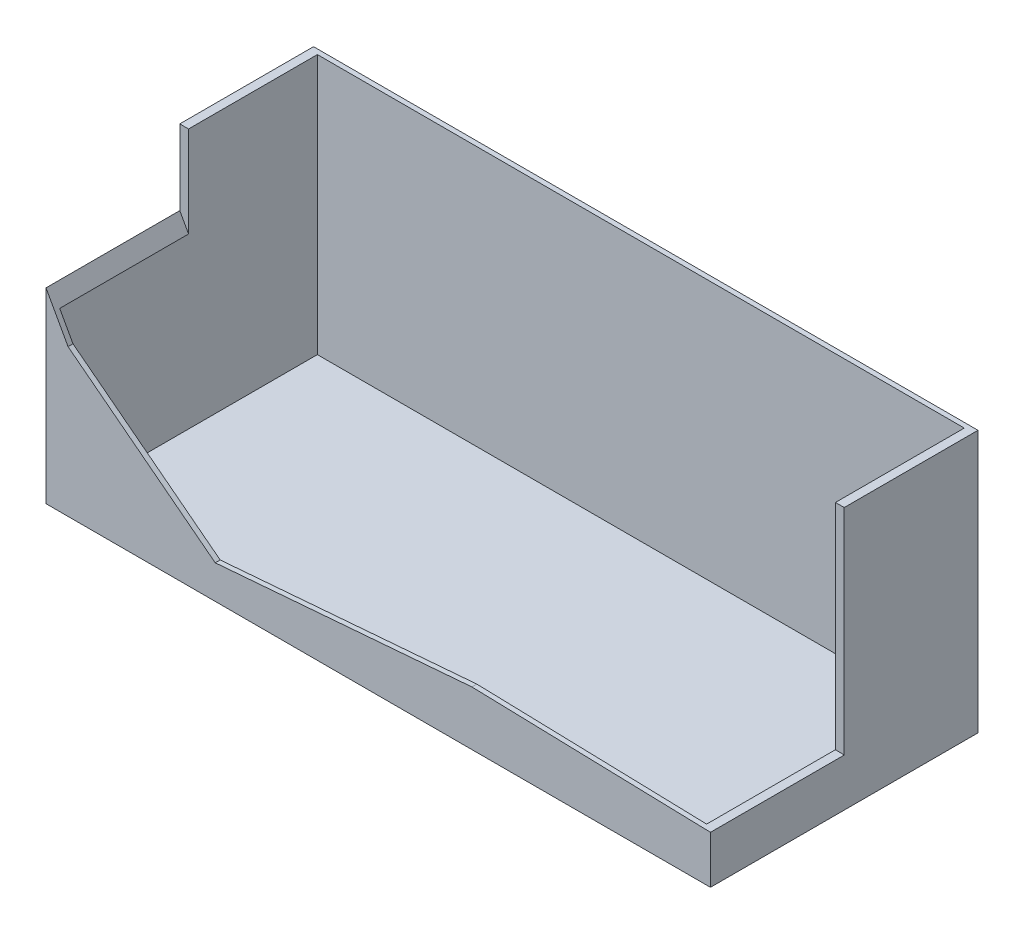
ISO-10303-21;
HEADER;
FILE_DESCRIPTION(('STEP AP214'),'2;1');
FILE_NAME('part.step','',(''),(''),'','','');
FILE_SCHEMA(('AUTOMOTIVE_DESIGN { 1 0 10303 214 1 1 1 1 }'));
ENDSEC;
DATA;
#1=APPLICATION_CONTEXT('core data for automotive mechanical design processes');
#2=APPLICATION_PROTOCOL_DEFINITION('international standard','automotive_design',2000,#1);
#3=PRODUCT_CONTEXT('',#1,'mechanical');
#4=PRODUCT('Part','Part','',(#3));
#5=PRODUCT_RELATED_PRODUCT_CATEGORY('part','',(#4));
#6=PRODUCT_DEFINITION_FORMATION('','',#4);
#7=PRODUCT_DEFINITION_CONTEXT('part definition',#1,'design');
#8=PRODUCT_DEFINITION('design','',#6,#7);
#9=PRODUCT_DEFINITION_SHAPE('','',#8);
#10=(LENGTH_UNIT() NAMED_UNIT(*) SI_UNIT(.MILLI.,.METRE.));
#11=(NAMED_UNIT(*) PLANE_ANGLE_UNIT() SI_UNIT($,.RADIAN.));
#12=(NAMED_UNIT(*) SI_UNIT($,.STERADIAN.) SOLID_ANGLE_UNIT());
#13=UNCERTAINTY_MEASURE_WITH_UNIT(LENGTH_MEASURE(1.E-05),#10,'distance_accuracy_value','');
#14=(GEOMETRIC_REPRESENTATION_CONTEXT(3) GLOBAL_UNCERTAINTY_ASSIGNED_CONTEXT((#13)) GLOBAL_UNIT_ASSIGNED_CONTEXT((#10,
#11,#12)) REPRESENTATION_CONTEXT('',''));
#15=CARTESIAN_POINT('',(0.,0.,0.));
#16=DIRECTION('',(0.,0.,1.));
#17=DIRECTION('',(1.,0.,0.));
#18=AXIS2_PLACEMENT_3D('',#15,#16,#17);
#19=CARTESIAN_POINT('',(0.,2390.,0.));
#20=DIRECTION('',(0.,-1.,0.));
#21=DIRECTION('',(0.,0.,-1.));
#22=AXIS2_PLACEMENT_3D('',#19,#20,#21);
#23=PLANE('',#22);
#24=DIRECTION('',(-1.,0.,0.));
#25=VECTOR('',#24,1.);
#26=CARTESIAN_POINT('',(0.,2390.,0.));
#27=LINE('',#26,#25);
#28=CARTESIAN_POINT('',(3030.,2390.,0.));
#29=VERTEX_POINT('',#28);
#30=CARTESIAN_POINT('',(2950.,2390.,0.));
#31=VERTEX_POINT('',#30);
#32=EDGE_CURVE('E187',#29,#31,#27,.T.);
#33=ORIENTED_EDGE('',*,*,#32,.F.);
#34=DIRECTION('',(0.,0.,-1.));
#35=VECTOR('',#34,1.);
#36=CARTESIAN_POINT('',(3030.,2390.,1220.));
#37=LINE('',#36,#35);
#38=CARTESIAN_POINT('',(3030.,2390.,-1220.));
#39=VERTEX_POINT('',#38);
#40=EDGE_CURVE('E216',#29,#39,#37,.T.);
#41=ORIENTED_EDGE('',*,*,#40,.T.);
#42=DIRECTION('',(-1.,0.,0.));
#43=VECTOR('',#42,1.);
#44=CARTESIAN_POINT('',(-3030.,2390.,-1220.));
#45=LINE('',#44,#43);
#46=CARTESIAN_POINT('',(-3030.,2390.,-1220.));
#47=VERTEX_POINT('',#46);
#48=EDGE_CURVE('E218',#39,#47,#45,.T.);
#49=ORIENTED_EDGE('',*,*,#48,.T.);
#50=DIRECTION('',(0.,0.,1.));
#51=VECTOR('',#50,1.);
#52=CARTESIAN_POINT('',(-3030.,2390.,1220.));
#53=LINE('',#52,#51);
#54=CARTESIAN_POINT('',(-3030.,2390.,0.));
#55=VERTEX_POINT('',#54);
#56=EDGE_CURVE('E221',#47,#55,#53,.T.);
#57=ORIENTED_EDGE('',*,*,#56,.T.);
#58=CARTESIAN_POINT('',(-2950.,2390.,0.));
#59=VERTEX_POINT('',#58);
#60=EDGE_CURVE('E190',#59,#55,#27,.T.);
#61=ORIENTED_EDGE('',*,*,#60,.F.);
#62=DIRECTION('',(0.,0.,1.));
#63=VECTOR('',#62,1.);
#64=CARTESIAN_POINT('',(-2950.,2390.,-1175.));
#65=LINE('',#64,#63);
#66=CARTESIAN_POINT('',(-2950.,2390.,-1175.));
#67=VERTEX_POINT('',#66);
#68=EDGE_CURVE('E206',#67,#59,#65,.T.);
#69=ORIENTED_EDGE('',*,*,#68,.F.);
#70=DIRECTION('',(-1.,0.,0.));
#71=VECTOR('',#70,1.);
#72=CARTESIAN_POINT('',(2950.,2390.,-1175.));
#73=LINE('',#72,#71);
#74=CARTESIAN_POINT('',(2950.,2390.,-1175.));
#75=VERTEX_POINT('',#74);
#76=EDGE_CURVE('E147',#75,#67,#73,.T.);
#77=ORIENTED_EDGE('',*,*,#76,.F.);
#78=DIRECTION('',(0.,0.,-1.));
#79=VECTOR('',#78,1.);
#80=CARTESIAN_POINT('',(2950.,2390.,-1175.));
#81=LINE('',#80,#79);
#82=EDGE_CURVE('E208',#31,#75,#81,.T.);
#83=ORIENTED_EDGE('',*,*,#82,.F.);
#84=EDGE_LOOP('',(#33,#41,#49,#57,#61,#69,#77,#83));
#85=FACE_BOUND('',#84,.T.);
#86=ADVANCED_FACE('F33',(#85),#23,.F.);
#87=CARTESIAN_POINT('',(3030.,2390.,1220.));
#88=DIRECTION('',(-1.,0.,0.));
#89=DIRECTION('',(0.,0.,1.));
#90=AXIS2_PLACEMENT_3D('',#87,#88,#89);
#91=PLANE('',#90);
#92=DIRECTION('',(0.,-1.,0.));
#93=VECTOR('',#92,1.);
#94=CARTESIAN_POINT('',(3030.,2390.,1220.));
#95=LINE('',#94,#93);
#96=CARTESIAN_POINT('',(3030.,434.828509298348,1220.));
#97=VERTEX_POINT('',#96);
#98=CARTESIAN_POINT('',(3030.,0.,1220.));
#99=VERTEX_POINT('',#98);
#100=EDGE_CURVE('E224',#97,#99,#95,.T.);
#101=ORIENTED_EDGE('',*,*,#100,.T.);
#102=DIRECTION('',(0.,0.,-1.));
#103=VECTOR('',#102,1.);
#104=CARTESIAN_POINT('',(3030.,0.,1220.));
#105=LINE('',#104,#103);
#106=CARTESIAN_POINT('',(3030.,0.,-1220.));
#107=VERTEX_POINT('',#106);
#108=EDGE_CURVE('E215',#99,#107,#105,.T.);
#109=ORIENTED_EDGE('',*,*,#108,.T.);
#110=DIRECTION('',(0.,-1.,0.));
#111=VECTOR('',#110,1.);
#112=CARTESIAN_POINT('',(3030.,2390.,-1220.));
#113=LINE('',#112,#111);
#114=EDGE_CURVE('E240',#39,#107,#113,.T.);
#115=ORIENTED_EDGE('',*,*,#114,.F.);
#116=ORIENTED_EDGE('',*,*,#40,.F.);
#117=DIRECTION('',(0.,1.,0.));
#118=VECTOR('',#117,1.);
#119=CARTESIAN_POINT('',(3030.,2390.,0.));
#120=LINE('',#119,#118);
#121=CARTESIAN_POINT('',(3030.,434.828509298348,0.));
#122=VERTEX_POINT('',#121);
#123=EDGE_CURVE('E189',#122,#29,#120,.T.);
#124=ORIENTED_EDGE('',*,*,#123,.F.);
#125=DIRECTION('',(0.,0.,-1.));
#126=VECTOR('',#125,1.);
#127=CARTESIAN_POINT('',(3030.,434.828509298348,1220.));
#128=LINE('',#127,#126);
#129=EDGE_CURVE('E200',#97,#122,#128,.T.);
#130=ORIENTED_EDGE('',*,*,#129,.F.);
#131=EDGE_LOOP('',(#101,#109,#115,#116,#124,#130));
#132=FACE_BOUND('',#131,.T.);
#133=ADVANCED_FACE('F35',(#132),#91,.F.);
#134=CARTESIAN_POINT('',(-3030.,2390.,1220.));
#135=DIRECTION('',(1.,0.,0.));
#136=DIRECTION('',(0.,0.,-1.));
#137=AXIS2_PLACEMENT_3D('',#134,#135,#136);
#138=PLANE('',#137);
#139=DIRECTION('',(0.,-1.,0.));
#140=VECTOR('',#139,1.);
#141=CARTESIAN_POINT('',(-3030.,2390.,-1220.));
#142=LINE('',#141,#140);
#143=CARTESIAN_POINT('',(-3030.,0.,-1220.));
#144=VERTEX_POINT('',#143);
#145=EDGE_CURVE('E238',#47,#144,#142,.T.);
#146=ORIENTED_EDGE('',*,*,#145,.T.);
#147=DIRECTION('',(0.,0.,1.));
#148=VECTOR('',#147,1.);
#149=CARTESIAN_POINT('',(-3030.,0.,1220.));
#150=LINE('',#149,#148);
#151=CARTESIAN_POINT('',(-3030.,0.,1220.));
#152=VERTEX_POINT('',#151);
#153=EDGE_CURVE('E230',#144,#152,#150,.T.);
#154=ORIENTED_EDGE('',*,*,#153,.T.);
#155=DIRECTION('',(0.,-1.,0.));
#156=VECTOR('',#155,1.);
#157=CARTESIAN_POINT('',(-3030.,2390.,1220.));
#158=LINE('',#157,#156);
#159=CARTESIAN_POINT('',(-3030.,1705.07723488189,1220.));
#160=VERTEX_POINT('',#159);
#161=EDGE_CURVE('E236',#160,#152,#158,.T.);
#162=ORIENTED_EDGE('',*,*,#161,.F.);
#163=DIRECTION('',(0.,0.,1.));
#164=VECTOR('',#163,1.);
#165=CARTESIAN_POINT('',(-3030.,1705.07723488189,1220.));
#166=LINE('',#165,#164);
#167=CARTESIAN_POINT('',(-3030.,1705.07723488189,0.));
#168=VERTEX_POINT('',#167);
#169=EDGE_CURVE('E204',#168,#160,#166,.T.);
#170=ORIENTED_EDGE('',*,*,#169,.F.);
#171=DIRECTION('',(0.,-1.,0.));
#172=VECTOR('',#171,1.);
#173=CARTESIAN_POINT('',(-3030.,2390.,0.));
#174=LINE('',#173,#172);
#175=EDGE_CURVE('E195',#55,#168,#174,.T.);
#176=ORIENTED_EDGE('',*,*,#175,.F.);
#177=ORIENTED_EDGE('',*,*,#56,.F.);
#178=EDGE_LOOP('',(#146,#154,#162,#170,#176,#177));
#179=FACE_BOUND('',#178,.T.);
#180=ADVANCED_FACE('F269',(#179),#138,.F.);
#181=CARTESIAN_POINT('',(-3030.,2390.,1220.));
#182=DIRECTION('',(0.,0.,-1.));
#183=DIRECTION('',(-1.,0.,0.));
#184=AXIS2_PLACEMENT_3D('',#181,#182,#183);
#185=PLANE('',#184);
#186=ORIENTED_EDGE('',*,*,#161,.T.);
#187=DIRECTION('',(1.,0.,0.));
#188=VECTOR('',#187,1.);
#189=CARTESIAN_POINT('',(-3030.,0.,1220.));
#190=LINE('',#189,#188);
#191=EDGE_CURVE('E219',#152,#99,#190,.T.);
#192=ORIENTED_EDGE('',*,*,#191,.T.);
#193=ORIENTED_EDGE('',*,*,#100,.F.);
#194=DIRECTION('',(0.999617636638247,-0.0276510491982812,0.));
#195=VECTOR('',#194,1.);
#196=CARTESIAN_POINT('',(854.001038062535,495.020178739367,1220.));
#197=LINE('',#196,#195);
#198=CARTESIAN_POINT('',(854.001038062535,495.020178739367,1220.));
#199=VERTEX_POINT('',#198);
#200=EDGE_CURVE('E172',#199,#97,#197,.T.);
#201=ORIENTED_EDGE('',*,*,#200,.F.);
#202=DIRECTION('',(0.996720748067837,0.0809181708338226,0.));
#203=VECTOR('',#202,1.);
#204=CARTESIAN_POINT('',(-1486.38471924519,305.017377158293,1220.));
#205=LINE('',#204,#203);
#206=CARTESIAN_POINT('',(-1486.38471924519,305.017377158293,1220.));
#207=VERTEX_POINT('',#206);
#208=EDGE_CURVE('E170',#207,#199,#205,.T.);
#209=ORIENTED_EDGE('',*,*,#208,.F.);
#210=DIRECTION('',(0.79165389315685,-0.610969813861211,0.));
#211=VECTOR('',#210,1.);
#212=CARTESIAN_POINT('',(-2829.06610650991,1341.25026168414,1220.));
#213=LINE('',#212,#211);
#214=CARTESIAN_POINT('',(-2829.06610650991,1341.25026168414,1220.));
#215=VERTEX_POINT('',#214);
#216=EDGE_CURVE('E167',#215,#207,#213,.T.);
#217=ORIENTED_EDGE('',*,*,#216,.F.);
#218=DIRECTION('',(0.483449472044467,-0.875372268226454,0.));
#219=VECTOR('',#218,1.);
#220=CARTESIAN_POINT('',(-3446.15752728708,2458.60532761151,1220.));
#221=LINE('',#220,#219);
#222=EDGE_CURVE('E165',#160,#215,#221,.T.);
#223=ORIENTED_EDGE('',*,*,#222,.F.);
#224=EDGE_LOOP('',(#186,#192,#193,#201,#209,#217,#223));
#225=FACE_BOUND('',#224,.T.);
#226=ADVANCED_FACE('F275',(#225),#185,.F.);
#227=CARTESIAN_POINT('',(-2950.,2390.,-1175.));
#228=DIRECTION('',(1.,0.,0.));
#229=DIRECTION('',(0.,0.,-1.));
#230=AXIS2_PLACEMENT_3D('',#227,#228,#229);
#231=PLANE('',#230);
#232=DIRECTION('',(0.,0.,1.));
#233=VECTOR('',#232,1.);
#234=CARTESIAN_POINT('',(-2950.,20.,-1175.));
#235=LINE('',#234,#233);
#236=CARTESIAN_POINT('',(-2950.,20.,-1175.));
#237=VERTEX_POINT('',#236);
#238=CARTESIAN_POINT('',(-2950.,20.,1175.));
#239=VERTEX_POINT('',#238);
#240=EDGE_CURVE('E154',#237,#239,#235,.T.);
#241=ORIENTED_EDGE('',*,*,#240,.F.);
#242=DIRECTION('',(0.,-1.,0.));
#243=VECTOR('',#242,1.);
#244=CARTESIAN_POINT('',(-2950.,2390.,-1175.));
#245=LINE('',#244,#243);
#246=EDGE_CURVE('E142',#67,#237,#245,.T.);
#247=ORIENTED_EDGE('',*,*,#246,.F.);
#248=ORIENTED_EDGE('',*,*,#68,.T.);
#249=DIRECTION('',(0.,-1.,0.));
#250=VECTOR('',#249,1.);
#251=CARTESIAN_POINT('',(-2950.,2390.,0.));
#252=LINE('',#251,#250);
#253=CARTESIAN_POINT('',(-2950.,1560.22283849179,0.));
#254=VERTEX_POINT('',#253);
#255=EDGE_CURVE('E192',#59,#254,#252,.T.);
#256=ORIENTED_EDGE('',*,*,#255,.T.);
#257=DIRECTION('',(0.,0.,1.));
#258=VECTOR('',#257,1.);
#259=CARTESIAN_POINT('',(-2950.,1560.22283849179,-1175.));
#260=LINE('',#259,#258);
#261=CARTESIAN_POINT('',(-2950.,1560.22283849179,1175.));
#262=VERTEX_POINT('',#261);
#263=EDGE_CURVE('E202',#254,#262,#260,.T.);
#264=ORIENTED_EDGE('',*,*,#263,.T.);
#265=DIRECTION('',(0.,-1.,0.));
#266=VECTOR('',#265,1.);
#267=CARTESIAN_POINT('',(-2950.,2390.,1175.));
#268=LINE('',#267,#266);
#269=EDGE_CURVE('E157',#262,#239,#268,.T.);
#270=ORIENTED_EDGE('',*,*,#269,.T.);
#271=EDGE_LOOP('',(#241,#247,#248,#256,#264,#270));
#272=FACE_BOUND('',#271,.T.);
#273=ADVANCED_FACE('F155',(#272),#231,.T.);
#274=CARTESIAN_POINT('',(2950.,2390.,1175.));
#275=DIRECTION('',(0.,0.,-1.));
#276=DIRECTION('',(-1.,0.,0.));
#277=AXIS2_PLACEMENT_3D('',#274,#275,#276);
#278=PLANE('',#277);
#279=DIRECTION('',(1.,0.,0.));
#280=VECTOR('',#279,1.);
#281=CARTESIAN_POINT('',(2950.,20.,1175.));
#282=LINE('',#281,#280);
#283=CARTESIAN_POINT('',(2950.,20.,1175.));
#284=VERTEX_POINT('',#283);
#285=EDGE_CURVE('E48',#239,#284,#282,.T.);
#286=ORIENTED_EDGE('',*,*,#285,.F.);
#287=ORIENTED_EDGE('',*,*,#269,.F.);
#288=DIRECTION('',(0.483449472044467,-0.875372268226454,0.));
#289=VECTOR('',#288,1.);
#290=CARTESIAN_POINT('',(-1922.19223878003,-300.808072215522,1175.));
#291=LINE('',#290,#289);
#292=CARTESIAN_POINT('',(-2829.06610650991,1341.25026168414,1175.));
#293=VERTEX_POINT('',#292);
#294=EDGE_CURVE('E41',#262,#293,#291,.T.);
#295=ORIENTED_EDGE('',*,*,#294,.T.);
#296=DIRECTION('',(0.79165389315685,-0.610969813861211,0.));
#297=VECTOR('',#296,1.);
#298=CARTESIAN_POINT('',(285.510690893212,-1062.46735104389,1175.));
#299=LINE('',#298,#297);
#300=CARTESIAN_POINT('',(-1486.38471924519,305.017377158293,1175.));
#301=VERTEX_POINT('',#300);
#302=EDGE_CURVE('E251',#293,#301,#299,.T.);
#303=ORIENTED_EDGE('',*,*,#302,.T.);
#304=DIRECTION('',(0.996720748067837,0.0809181708338226,0.));
#305=VECTOR('',#304,1.);
#306=CARTESIAN_POINT('',(3089.11138800307,676.476260073618,1175.));
#307=LINE('',#306,#305);
#308=CARTESIAN_POINT('',(854.001038062535,495.020178739367,1175.));
#309=VERTEX_POINT('',#308);
#310=EDGE_CURVE('E248',#301,#309,#307,.T.);
#311=ORIENTED_EDGE('',*,*,#310,.T.);
#312=DIRECTION('',(0.999617636638247,-0.0276510491982812,0.));
#313=VECTOR('',#312,1.);
#314=CARTESIAN_POINT('',(2896.01929489699,438.534633452863,1175.));
#315=LINE('',#314,#313);
#316=CARTESIAN_POINT('',(2950.,437.041439377595,1175.));
#317=VERTEX_POINT('',#316);
#318=EDGE_CURVE('E197',#309,#317,#315,.T.);
#319=ORIENTED_EDGE('',*,*,#318,.T.);
#320=DIRECTION('',(0.,-1.,0.));
#321=VECTOR('',#320,1.);
#322=CARTESIAN_POINT('',(2950.,2390.,1175.));
#323=LINE('',#322,#321);
#324=EDGE_CURVE('E212',#317,#284,#323,.T.);
#325=ORIENTED_EDGE('',*,*,#324,.T.);
#326=EDGE_LOOP('',(#286,#287,#295,#303,#311,#319,#325));
#327=FACE_BOUND('',#326,.T.);
#328=ADVANCED_FACE('F254',(#327),#278,.T.);
#329=CARTESIAN_POINT('',(2950.,2390.,-1175.));
#330=DIRECTION('',(-1.,0.,0.));
#331=DIRECTION('',(0.,0.,1.));
#332=AXIS2_PLACEMENT_3D('',#329,#330,#331);
#333=PLANE('',#332);
#334=DIRECTION('',(0.,0.,-1.));
#335=VECTOR('',#334,1.);
#336=CARTESIAN_POINT('',(2950.,20.,-1175.));
#337=LINE('',#336,#335);
#338=CARTESIAN_POINT('',(2950.,20.,-1175.));
#339=VERTEX_POINT('',#338);
#340=EDGE_CURVE('E56',#284,#339,#337,.T.);
#341=ORIENTED_EDGE('',*,*,#340,.F.);
#342=ORIENTED_EDGE('',*,*,#324,.F.);
#343=DIRECTION('',(0.,0.,-1.));
#344=VECTOR('',#343,1.);
#345=CARTESIAN_POINT('',(2950.,437.041439377595,-1175.));
#346=LINE('',#345,#344);
#347=CARTESIAN_POINT('',(2950.,437.041439377595,0.));
#348=VERTEX_POINT('',#347);
#349=EDGE_CURVE('E245',#317,#348,#346,.T.);
#350=ORIENTED_EDGE('',*,*,#349,.T.);
#351=DIRECTION('',(0.,1.,0.));
#352=VECTOR('',#351,1.);
#353=CARTESIAN_POINT('',(2950.,2390.,0.));
#354=LINE('',#353,#352);
#355=EDGE_CURVE('E242',#348,#31,#354,.T.);
#356=ORIENTED_EDGE('',*,*,#355,.T.);
#357=ORIENTED_EDGE('',*,*,#82,.T.);
#358=DIRECTION('',(0.,-1.,0.));
#359=VECTOR('',#358,1.);
#360=CARTESIAN_POINT('',(2950.,2390.,-1175.));
#361=LINE('',#360,#359);
#362=EDGE_CURVE('E151',#75,#339,#361,.T.);
#363=ORIENTED_EDGE('',*,*,#362,.T.);
#364=EDGE_LOOP('',(#341,#342,#350,#356,#357,#363));
#365=FACE_BOUND('',#364,.T.);
#366=ADVANCED_FACE('F297',(#365),#333,.T.);
#367=CARTESIAN_POINT('',(0.,0.,0.));
#368=DIRECTION('',(0.,-1.,0.));
#369=DIRECTION('',(0.,0.,-1.));
#370=AXIS2_PLACEMENT_3D('',#367,#368,#369);
#371=PLANE('',#370);
#372=ORIENTED_EDGE('',*,*,#108,.F.);
#373=ORIENTED_EDGE('',*,*,#191,.F.);
#374=ORIENTED_EDGE('',*,*,#153,.F.);
#375=DIRECTION('',(-1.,0.,0.));
#376=VECTOR('',#375,1.);
#377=CARTESIAN_POINT('',(-3030.,0.,-1220.));
#378=LINE('',#377,#376);
#379=EDGE_CURVE('E227',#107,#144,#378,.T.);
#380=ORIENTED_EDGE('',*,*,#379,.F.);
#381=EDGE_LOOP('',(#372,#373,#374,#380));
#382=FACE_BOUND('',#381,.T.);
#383=ADVANCED_FACE('F282',(#382),#371,.T.);
#384=CARTESIAN_POINT('',(-3030.,2390.,-1220.));
#385=DIRECTION('',(0.,0.,1.));
#386=DIRECTION('',(1.,0.,0.));
#387=AXIS2_PLACEMENT_3D('',#384,#385,#386);
#388=PLANE('',#387);
#389=ORIENTED_EDGE('',*,*,#114,.T.);
#390=ORIENTED_EDGE('',*,*,#379,.T.);
#391=ORIENTED_EDGE('',*,*,#145,.F.);
#392=ORIENTED_EDGE('',*,*,#48,.F.);
#393=EDGE_LOOP('',(#389,#390,#391,#392));
#394=FACE_BOUND('',#393,.T.);
#395=ADVANCED_FACE('F299',(#394),#388,.F.);
#396=CARTESIAN_POINT('',(2950.,2390.,-1175.));
#397=DIRECTION('',(0.,0.,1.));
#398=DIRECTION('',(1.,0.,0.));
#399=AXIS2_PLACEMENT_3D('',#396,#397,#398);
#400=PLANE('',#399);
#401=DIRECTION('',(-1.,0.,0.));
#402=VECTOR('',#401,1.);
#403=CARTESIAN_POINT('',(2950.,20.,-1175.));
#404=LINE('',#403,#402);
#405=EDGE_CURVE('E11',#339,#237,#404,.T.);
#406=ORIENTED_EDGE('',*,*,#405,.F.);
#407=ORIENTED_EDGE('',*,*,#362,.F.);
#408=ORIENTED_EDGE('',*,*,#76,.T.);
#409=ORIENTED_EDGE('',*,*,#246,.T.);
#410=EDGE_LOOP('',(#406,#407,#408,#409));
#411=FACE_BOUND('',#410,.T.);
#412=ADVANCED_FACE('F144',(#411),#400,.T.);
#413=CARTESIAN_POINT('',(-3446.15752728708,2458.60532761151,1220.));
#414=DIRECTION('',(0.875372268226454,0.483449472044467,0.));
#415=DIRECTION('',(-0.483449472044467,0.875372268226454,0.));
#416=AXIS2_PLACEMENT_3D('',#413,#414,#415);
#417=PLANE('',#416);
#418=ORIENTED_EDGE('',*,*,#169,.T.);
#419=ORIENTED_EDGE('',*,*,#222,.T.);
#420=DIRECTION('',(0.,0.,-1.));
#421=VECTOR('',#420,1.);
#422=CARTESIAN_POINT('',(-2829.06610650991,1341.25026168414,1220.));
#423=LINE('',#422,#421);
#424=EDGE_CURVE('E184',#215,#293,#423,.T.);
#425=ORIENTED_EDGE('',*,*,#424,.T.);
#426=ORIENTED_EDGE('',*,*,#294,.F.);
#427=ORIENTED_EDGE('',*,*,#263,.F.);
#428=DIRECTION('',(0.483449472044467,-0.875372268226454,0.));
#429=VECTOR('',#428,1.);
#430=CARTESIAN_POINT('',(-3446.15752728708,2458.60532761151,0.));
#431=LINE('',#430,#429);
#432=EDGE_CURVE('E159',#168,#254,#431,.T.);
#433=ORIENTED_EDGE('',*,*,#432,.F.);
#434=EDGE_LOOP('',(#418,#419,#425,#426,#427,#433));
#435=FACE_BOUND('',#434,.T.);
#436=ADVANCED_FACE('F256',(#435),#417,.T.);
#437=CARTESIAN_POINT('',(854.001038062535,495.020178739367,1220.));
#438=DIRECTION('',(0.0276510491982812,0.999617636638247,0.));
#439=DIRECTION('',(-0.999617636638247,0.0276510491982812,0.));
#440=AXIS2_PLACEMENT_3D('',#437,#438,#439);
#441=PLANE('',#440);
#442=ORIENTED_EDGE('',*,*,#129,.T.);
#443=DIRECTION('',(0.999617636638247,-0.0276510491982812,0.));
#444=VECTOR('',#443,1.);
#445=CARTESIAN_POINT('',(854.001038062535,495.020178739367,0.));
#446=LINE('',#445,#444);
#447=EDGE_CURVE('E168',#348,#122,#446,.T.);
#448=ORIENTED_EDGE('',*,*,#447,.F.);
#449=ORIENTED_EDGE('',*,*,#349,.F.);
#450=ORIENTED_EDGE('',*,*,#318,.F.);
#451=DIRECTION('',(0.,0.,-1.));
#452=VECTOR('',#451,1.);
#453=CARTESIAN_POINT('',(854.001038062535,495.020178739367,1220.));
#454=LINE('',#453,#452);
#455=EDGE_CURVE('E174',#199,#309,#454,.T.);
#456=ORIENTED_EDGE('',*,*,#455,.F.);
#457=ORIENTED_EDGE('',*,*,#200,.T.);
#458=EDGE_LOOP('',(#442,#448,#449,#450,#456,#457));
#459=FACE_BOUND('',#458,.T.);
#460=ADVANCED_FACE('F292',(#459),#441,.T.);
#461=CARTESIAN_POINT('',(0.,0.,0.));
#462=DIRECTION('',(0.,0.,1.));
#463=DIRECTION('',(1.,0.,0.));
#464=AXIS2_PLACEMENT_3D('',#461,#462,#463);
#465=PLANE('',#464);
#466=ORIENTED_EDGE('',*,*,#175,.T.);
#467=ORIENTED_EDGE('',*,*,#432,.T.);
#468=ORIENTED_EDGE('',*,*,#255,.F.);
#469=ORIENTED_EDGE('',*,*,#60,.T.);
#470=EDGE_LOOP('',(#466,#467,#468,#469));
#471=FACE_BOUND('',#470,.T.);
#472=ADVANCED_FACE('F261',(#471),#465,.T.);
#473=ORIENTED_EDGE('',*,*,#123,.T.);
#474=ORIENTED_EDGE('',*,*,#32,.T.);
#475=ORIENTED_EDGE('',*,*,#355,.F.);
#476=ORIENTED_EDGE('',*,*,#447,.T.);
#477=EDGE_LOOP('',(#473,#474,#475,#476));
#478=FACE_BOUND('',#477,.T.);
#479=ADVANCED_FACE('F295',(#478),#465,.T.);
#480=CARTESIAN_POINT('',(-2829.06610650991,1341.25026168414,1220.));
#481=DIRECTION('',(0.610969813861211,0.79165389315685,0.));
#482=DIRECTION('',(-0.79165389315685,0.610969813861211,0.));
#483=AXIS2_PLACEMENT_3D('',#480,#481,#482);
#484=PLANE('',#483);
#485=ORIENTED_EDGE('',*,*,#424,.F.);
#486=ORIENTED_EDGE('',*,*,#216,.T.);
#487=DIRECTION('',(0.,0.,-1.));
#488=VECTOR('',#487,1.);
#489=CARTESIAN_POINT('',(-1486.38471924519,305.017377158293,1220.));
#490=LINE('',#489,#488);
#491=EDGE_CURVE('E181',#207,#301,#490,.T.);
#492=ORIENTED_EDGE('',*,*,#491,.T.);
#493=ORIENTED_EDGE('',*,*,#302,.F.);
#494=EDGE_LOOP('',(#485,#486,#492,#493));
#495=FACE_BOUND('',#494,.T.);
#496=ADVANCED_FACE('F385',(#495),#484,.T.);
#497=CARTESIAN_POINT('',(-1486.38471924519,305.017377158293,1220.));
#498=DIRECTION('',(-0.0809181708338226,0.996720748067837,0.));
#499=DIRECTION('',(-0.996720748067837,-0.0809181708338226,0.));
#500=AXIS2_PLACEMENT_3D('',#497,#498,#499);
#501=PLANE('',#500);
#502=ORIENTED_EDGE('',*,*,#491,.F.);
#503=ORIENTED_EDGE('',*,*,#208,.T.);
#504=ORIENTED_EDGE('',*,*,#455,.T.);
#505=ORIENTED_EDGE('',*,*,#310,.F.);
#506=EDGE_LOOP('',(#502,#503,#504,#505));
#507=FACE_BOUND('',#506,.T.);
#508=ADVANCED_FACE('F391',(#507),#501,.T.);
#509=CARTESIAN_POINT('',(0.,20.,0.));
#510=DIRECTION('',(0.,1.,0.));
#511=DIRECTION('',(0.,0.,1.));
#512=AXIS2_PLACEMENT_3D('',#509,#510,#511);
#513=PLANE('',#512);
#514=ORIENTED_EDGE('',*,*,#405,.T.);
#515=ORIENTED_EDGE('',*,*,#240,.T.);
#516=ORIENTED_EDGE('',*,*,#285,.T.);
#517=ORIENTED_EDGE('',*,*,#340,.T.);
#518=EDGE_LOOP('',(#514,#515,#516,#517));
#519=FACE_BOUND('',#518,.T.);
#520=ADVANCED_FACE('F161',(#519),#513,.T.);
#521=CLOSED_SHELL('',(#86,#133,#180,#226,#273,#328,#366,#383,#395,#412,#436,#460,#472,#479,#496,
#508,#520));
#522=MANIFOLD_SOLID_BREP('B2',#521);
#523=ADVANCED_BREP_SHAPE_REPRESENTATION('',(#18,#522),#14);
#524=SHAPE_DEFINITION_REPRESENTATION(#9,#523);
ENDSEC;
END-ISO-10303-21;
